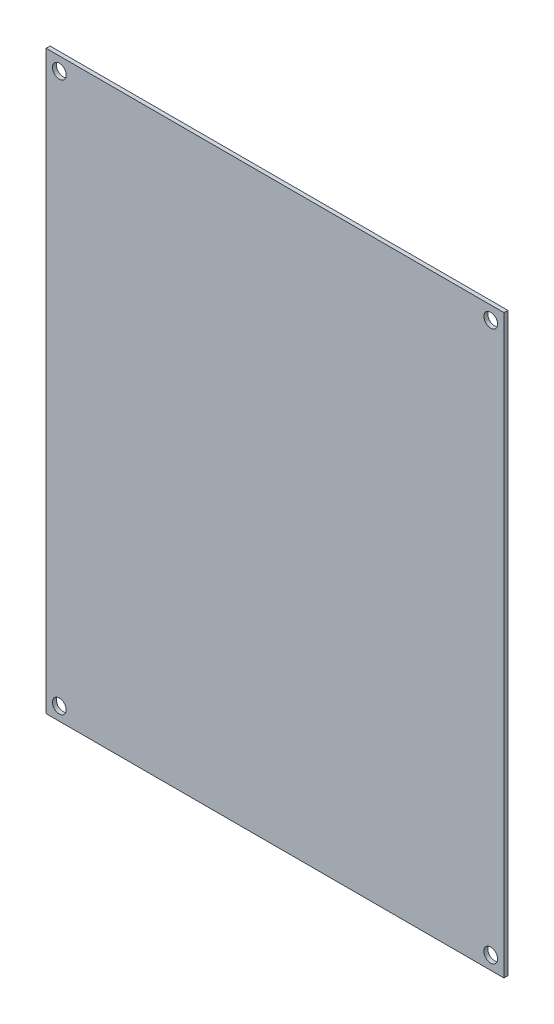
ISO-10303-21;
HEADER;
FILE_DESCRIPTION(('STEP AP214'),'2;1');
FILE_NAME('part.step','',(''),(''),'','','');
FILE_SCHEMA(('AUTOMOTIVE_DESIGN { 1 0 10303 214 1 1 1 1 }'));
ENDSEC;
DATA;
#1=APPLICATION_CONTEXT('core data for automotive mechanical design processes');
#2=APPLICATION_PROTOCOL_DEFINITION('international standard','automotive_design',2000,#1);
#3=PRODUCT_CONTEXT('',#1,'mechanical');
#4=PRODUCT('Part','Part','',(#3));
#5=PRODUCT_RELATED_PRODUCT_CATEGORY('part','',(#4));
#6=PRODUCT_DEFINITION_FORMATION('','',#4);
#7=PRODUCT_DEFINITION_CONTEXT('part definition',#1,'design');
#8=PRODUCT_DEFINITION('design','',#6,#7);
#9=PRODUCT_DEFINITION_SHAPE('','',#8);
#10=(LENGTH_UNIT() NAMED_UNIT(*) SI_UNIT(.MILLI.,.METRE.));
#11=(NAMED_UNIT(*) PLANE_ANGLE_UNIT() SI_UNIT($,.RADIAN.));
#12=(NAMED_UNIT(*) SI_UNIT($,.STERADIAN.) SOLID_ANGLE_UNIT());
#13=UNCERTAINTY_MEASURE_WITH_UNIT(LENGTH_MEASURE(1.E-05),#10,'distance_accuracy_value','');
#14=(GEOMETRIC_REPRESENTATION_CONTEXT(3) GLOBAL_UNCERTAINTY_ASSIGNED_CONTEXT((#13)) GLOBAL_UNIT_ASSIGNED_CONTEXT((#10,
#11,#12)) REPRESENTATION_CONTEXT('',''));
#15=CARTESIAN_POINT('',(0.,0.,0.));
#16=DIRECTION('',(0.,0.,1.));
#17=DIRECTION('',(1.,0.,0.));
#18=AXIS2_PLACEMENT_3D('',#15,#16,#17);
#19=CARTESIAN_POINT('',(0.,0.,1.));
#20=DIRECTION('',(0.,0.,1.));
#21=DIRECTION('',(1.,0.,0.));
#22=AXIS2_PLACEMENT_3D('',#19,#20,#21);
#23=PLANE('',#22);
#24=CARTESIAN_POINT('',(54.6500000000001,-69.65,1.));
#25=DIRECTION('',(0.,0.,1.));
#26=DIRECTION('',(1.,0.,0.));
#27=AXIS2_PLACEMENT_3D('',#24,#25,#26);
#28=CIRCLE('',#27,1.75);
#29=CARTESIAN_POINT('',(56.4000000000001,-69.65,1.));
#30=VERTEX_POINT('',#29);
#31=EDGE_CURVE('E123',#30,#30,#28,.T.);
#32=ORIENTED_EDGE('',*,*,#31,.F.);
#33=EDGE_LOOP('',(#32));
#34=FACE_BOUND('',#33,.T.);
#35=CARTESIAN_POINT('',(-54.65,69.65,1.));
#36=DIRECTION('',(0.,0.,1.));
#37=DIRECTION('',(1.,0.,0.));
#38=AXIS2_PLACEMENT_3D('',#35,#36,#37);
#39=CIRCLE('',#38,1.75);
#40=CARTESIAN_POINT('',(-52.9,69.65,1.));
#41=VERTEX_POINT('',#40);
#42=EDGE_CURVE('E102',#41,#41,#39,.T.);
#43=ORIENTED_EDGE('',*,*,#42,.F.);
#44=EDGE_LOOP('',(#43));
#45=FACE_BOUND('',#44,.T.);
#46=DIRECTION('',(0.,1.,0.));
#47=VECTOR('',#46,1.);
#48=CARTESIAN_POINT('',(58.,73.,1.));
#49=LINE('',#48,#47);
#50=CARTESIAN_POINT('',(58.,-73.,1.));
#51=VERTEX_POINT('',#50);
#52=CARTESIAN_POINT('',(58.,73.,1.));
#53=VERTEX_POINT('',#52);
#54=EDGE_CURVE('E87',#51,#53,#49,.T.);
#55=ORIENTED_EDGE('',*,*,#54,.T.);
#56=DIRECTION('',(-1.,0.,0.));
#57=VECTOR('',#56,1.);
#58=CARTESIAN_POINT('',(-58.,73.,1.));
#59=LINE('',#58,#57);
#60=CARTESIAN_POINT('',(-58.,73.,1.));
#61=VERTEX_POINT('',#60);
#62=EDGE_CURVE('E82',#53,#61,#59,.T.);
#63=ORIENTED_EDGE('',*,*,#62,.T.);
#64=DIRECTION('',(0.,-1.,0.));
#65=VECTOR('',#64,1.);
#66=CARTESIAN_POINT('',(-58.,73.,1.));
#67=LINE('',#66,#65);
#68=CARTESIAN_POINT('',(-58.,-73.,1.));
#69=VERTEX_POINT('',#68);
#70=EDGE_CURVE('E85',#61,#69,#67,.T.);
#71=ORIENTED_EDGE('',*,*,#70,.T.);
#72=DIRECTION('',(1.,0.,0.));
#73=VECTOR('',#72,1.);
#74=CARTESIAN_POINT('',(-58.,-73.,1.));
#75=LINE('',#74,#73);
#76=EDGE_CURVE('E52',#69,#51,#75,.T.);
#77=ORIENTED_EDGE('',*,*,#76,.T.);
#78=EDGE_LOOP('',(#55,#63,#71,#77));
#79=FACE_BOUND('',#78,.T.);
#80=CARTESIAN_POINT('',(54.65,69.65,1.));
#81=DIRECTION('',(0.,0.,1.));
#82=DIRECTION('',(1.,0.,0.));
#83=AXIS2_PLACEMENT_3D('',#80,#81,#82);
#84=CIRCLE('',#83,1.75);
#85=CARTESIAN_POINT('',(56.4,69.65,1.));
#86=VERTEX_POINT('',#85);
#87=EDGE_CURVE('E117',#86,#86,#84,.T.);
#88=ORIENTED_EDGE('',*,*,#87,.F.);
#89=EDGE_LOOP('',(#88));
#90=FACE_BOUND('',#89,.T.);
#91=CARTESIAN_POINT('',(-54.65,-69.65,1.));
#92=DIRECTION('',(0.,0.,1.));
#93=DIRECTION('',(1.,0.,0.));
#94=AXIS2_PLACEMENT_3D('',#91,#92,#93);
#95=CIRCLE('',#94,1.75);
#96=CARTESIAN_POINT('',(-52.9,-69.65,1.));
#97=VERTEX_POINT('',#96);
#98=EDGE_CURVE('E129',#97,#97,#95,.T.);
#99=ORIENTED_EDGE('',*,*,#98,.F.);
#100=EDGE_LOOP('',(#99));
#101=FACE_BOUND('',#100,.T.);
#102=ADVANCED_FACE('F35',(#34,#45,#79,#90,#101),#23,.T.);
#103=CARTESIAN_POINT('',(0.,0.,0.));
#104=DIRECTION('',(0.,0.,1.));
#105=DIRECTION('',(1.,0.,0.));
#106=AXIS2_PLACEMENT_3D('',#103,#104,#105);
#107=PLANE('',#106);
#108=DIRECTION('',(0.,1.,0.));
#109=VECTOR('',#108,1.);
#110=CARTESIAN_POINT('',(58.,73.,0.));
#111=LINE('',#110,#109);
#112=CARTESIAN_POINT('',(58.,-73.,0.));
#113=VERTEX_POINT('',#112);
#114=CARTESIAN_POINT('',(58.,73.,0.));
#115=VERTEX_POINT('',#114);
#116=EDGE_CURVE('E99',#113,#115,#111,.T.);
#117=ORIENTED_EDGE('',*,*,#116,.F.);
#118=DIRECTION('',(1.,0.,0.));
#119=VECTOR('',#118,1.);
#120=CARTESIAN_POINT('',(-58.,-73.,0.));
#121=LINE('',#120,#119);
#122=CARTESIAN_POINT('',(-58.,-73.,0.));
#123=VERTEX_POINT('',#122);
#124=EDGE_CURVE('E75',#123,#113,#121,.T.);
#125=ORIENTED_EDGE('',*,*,#124,.F.);
#126=DIRECTION('',(0.,-1.,0.));
#127=VECTOR('',#126,1.);
#128=CARTESIAN_POINT('',(-58.,73.,0.));
#129=LINE('',#128,#127);
#130=CARTESIAN_POINT('',(-58.,73.,0.));
#131=VERTEX_POINT('',#130);
#132=EDGE_CURVE('E69',#131,#123,#129,.T.);
#133=ORIENTED_EDGE('',*,*,#132,.F.);
#134=DIRECTION('',(-1.,0.,0.));
#135=VECTOR('',#134,1.);
#136=CARTESIAN_POINT('',(-58.,73.,0.));
#137=LINE('',#136,#135);
#138=EDGE_CURVE('E91',#115,#131,#137,.T.);
#139=ORIENTED_EDGE('',*,*,#138,.F.);
#140=EDGE_LOOP('',(#117,#125,#133,#139));
#141=FACE_BOUND('',#140,.T.);
#142=CARTESIAN_POINT('',(-54.65,69.65,0.));
#143=DIRECTION('',(0.,0.,1.));
#144=DIRECTION('',(1.,0.,0.));
#145=AXIS2_PLACEMENT_3D('',#142,#143,#144);
#146=CIRCLE('',#145,1.75);
#147=CARTESIAN_POINT('',(-52.9,69.65,0.));
#148=VERTEX_POINT('',#147);
#149=EDGE_CURVE('E114',#148,#148,#146,.T.);
#150=ORIENTED_EDGE('',*,*,#149,.T.);
#151=EDGE_LOOP('',(#150));
#152=FACE_BOUND('',#151,.T.);
#153=CARTESIAN_POINT('',(54.65,69.65,0.));
#154=DIRECTION('',(0.,0.,1.));
#155=DIRECTION('',(1.,0.,0.));
#156=AXIS2_PLACEMENT_3D('',#153,#154,#155);
#157=CIRCLE('',#156,1.75);
#158=CARTESIAN_POINT('',(56.4,69.65,0.));
#159=VERTEX_POINT('',#158);
#160=EDGE_CURVE('E120',#159,#159,#157,.T.);
#161=ORIENTED_EDGE('',*,*,#160,.T.);
#162=EDGE_LOOP('',(#161));
#163=FACE_BOUND('',#162,.T.);
#164=CARTESIAN_POINT('',(54.6500000000001,-69.65,0.));
#165=DIRECTION('',(0.,0.,1.));
#166=DIRECTION('',(1.,0.,0.));
#167=AXIS2_PLACEMENT_3D('',#164,#165,#166);
#168=CIRCLE('',#167,1.75);
#169=CARTESIAN_POINT('',(56.4000000000001,-69.65,0.));
#170=VERTEX_POINT('',#169);
#171=EDGE_CURVE('E126',#170,#170,#168,.T.);
#172=ORIENTED_EDGE('',*,*,#171,.T.);
#173=EDGE_LOOP('',(#172));
#174=FACE_BOUND('',#173,.T.);
#175=CARTESIAN_POINT('',(-54.65,-69.65,0.));
#176=DIRECTION('',(0.,0.,1.));
#177=DIRECTION('',(1.,0.,0.));
#178=AXIS2_PLACEMENT_3D('',#175,#176,#177);
#179=CIRCLE('',#178,1.75);
#180=CARTESIAN_POINT('',(-52.9,-69.65,0.));
#181=VERTEX_POINT('',#180);
#182=EDGE_CURVE('E132',#181,#181,#179,.T.);
#183=ORIENTED_EDGE('',*,*,#182,.T.);
#184=EDGE_LOOP('',(#183));
#185=FACE_BOUND('',#184,.T.);
#186=ADVANCED_FACE('F110',(#141,#152,#163,#174,#185),#107,.F.);
#187=CARTESIAN_POINT('',(58.,73.,1.));
#188=DIRECTION('',(-1.,0.,0.));
#189=DIRECTION('',(0.,0.,1.));
#190=AXIS2_PLACEMENT_3D('',#187,#188,#189);
#191=PLANE('',#190);
#192=ORIENTED_EDGE('',*,*,#116,.T.);
#193=DIRECTION('',(0.,0.,-1.));
#194=VECTOR('',#193,1.);
#195=CARTESIAN_POINT('',(58.,73.,1.));
#196=LINE('',#195,#194);
#197=EDGE_CURVE('E11',#53,#115,#196,.T.);
#198=ORIENTED_EDGE('',*,*,#197,.F.);
#199=ORIENTED_EDGE('',*,*,#54,.F.);
#200=DIRECTION('',(0.,0.,-1.));
#201=VECTOR('',#200,1.);
#202=CARTESIAN_POINT('',(58.,-73.,1.));
#203=LINE('',#202,#201);
#204=EDGE_CURVE('E95',#51,#113,#203,.T.);
#205=ORIENTED_EDGE('',*,*,#204,.T.);
#206=EDGE_LOOP('',(#192,#198,#199,#205));
#207=FACE_BOUND('',#206,.T.);
#208=ADVANCED_FACE('F37',(#207),#191,.F.);
#209=CARTESIAN_POINT('',(-58.,73.,1.));
#210=DIRECTION('',(0.,-1.,0.));
#211=DIRECTION('',(0.,0.,-1.));
#212=AXIS2_PLACEMENT_3D('',#209,#210,#211);
#213=PLANE('',#212);
#214=ORIENTED_EDGE('',*,*,#138,.T.);
#215=DIRECTION('',(0.,0.,-1.));
#216=VECTOR('',#215,1.);
#217=CARTESIAN_POINT('',(-58.,73.,1.));
#218=LINE('',#217,#216);
#219=EDGE_CURVE('E44',#61,#131,#218,.T.);
#220=ORIENTED_EDGE('',*,*,#219,.F.);
#221=ORIENTED_EDGE('',*,*,#62,.F.);
#222=ORIENTED_EDGE('',*,*,#197,.T.);
#223=EDGE_LOOP('',(#214,#220,#221,#222));
#224=FACE_BOUND('',#223,.T.);
#225=ADVANCED_FACE('F90',(#224),#213,.F.);
#226=CARTESIAN_POINT('',(-58.,73.,1.));
#227=DIRECTION('',(1.,0.,0.));
#228=DIRECTION('',(0.,1.,0.));
#229=AXIS2_PLACEMENT_3D('',#226,#227,#228);
#230=PLANE('',#229);
#231=ORIENTED_EDGE('',*,*,#132,.T.);
#232=DIRECTION('',(0.,0.,-1.));
#233=VECTOR('',#232,1.);
#234=CARTESIAN_POINT('',(-58.,-73.,1.));
#235=LINE('',#234,#233);
#236=EDGE_CURVE('E92',#69,#123,#235,.T.);
#237=ORIENTED_EDGE('',*,*,#236,.F.);
#238=ORIENTED_EDGE('',*,*,#70,.F.);
#239=ORIENTED_EDGE('',*,*,#219,.T.);
#240=EDGE_LOOP('',(#231,#237,#238,#239));
#241=FACE_BOUND('',#240,.T.);
#242=ADVANCED_FACE('F93',(#241),#230,.F.);
#243=CARTESIAN_POINT('',(-58.,-73.,1.));
#244=DIRECTION('',(0.,1.,0.));
#245=DIRECTION('',(0.,0.,1.));
#246=AXIS2_PLACEMENT_3D('',#243,#244,#245);
#247=PLANE('',#246);
#248=ORIENTED_EDGE('',*,*,#124,.T.);
#249=ORIENTED_EDGE('',*,*,#204,.F.);
#250=ORIENTED_EDGE('',*,*,#76,.F.);
#251=ORIENTED_EDGE('',*,*,#236,.T.);
#252=EDGE_LOOP('',(#248,#249,#250,#251));
#253=FACE_BOUND('',#252,.T.);
#254=ADVANCED_FACE('F107',(#253),#247,.F.);
#255=CARTESIAN_POINT('',(-54.65,69.65,1.));
#256=DIRECTION('',(0.,0.,-1.));
#257=DIRECTION('',(-1.,0.,0.));
#258=AXIS2_PLACEMENT_3D('',#255,#256,#257);
#259=CYLINDRICAL_SURFACE('',#258,1.75);
#260=ORIENTED_EDGE('',*,*,#42,.T.);
#261=EDGE_LOOP('',(#260));
#262=FACE_BOUND('',#261,.T.);
#263=ORIENTED_EDGE('',*,*,#149,.F.);
#264=EDGE_LOOP('',(#263));
#265=FACE_BOUND('',#264,.T.);
#266=ADVANCED_FACE('F151',(#262,#265),#259,.F.);
#267=CARTESIAN_POINT('',(54.65,69.65,1.));
#268=DIRECTION('',(0.,0.,-1.));
#269=DIRECTION('',(-1.,0.,0.));
#270=AXIS2_PLACEMENT_3D('',#267,#268,#269);
#271=CYLINDRICAL_SURFACE('',#270,1.75);
#272=ORIENTED_EDGE('',*,*,#87,.T.);
#273=EDGE_LOOP('',(#272));
#274=FACE_BOUND('',#273,.T.);
#275=ORIENTED_EDGE('',*,*,#160,.F.);
#276=EDGE_LOOP('',(#275));
#277=FACE_BOUND('',#276,.T.);
#278=ADVANCED_FACE('F197',(#274,#277),#271,.F.);
#279=CARTESIAN_POINT('',(54.6500000000001,-69.65,1.));
#280=DIRECTION('',(0.,0.,-1.));
#281=DIRECTION('',(-1.,0.,0.));
#282=AXIS2_PLACEMENT_3D('',#279,#280,#281);
#283=CYLINDRICAL_SURFACE('',#282,1.75);
#284=ORIENTED_EDGE('',*,*,#31,.T.);
#285=EDGE_LOOP('',(#284));
#286=FACE_BOUND('',#285,.T.);
#287=ORIENTED_EDGE('',*,*,#171,.F.);
#288=EDGE_LOOP('',(#287));
#289=FACE_BOUND('',#288,.T.);
#290=ADVANCED_FACE('F205',(#286,#289),#283,.F.);
#291=CARTESIAN_POINT('',(-54.65,-69.65,1.));
#292=DIRECTION('',(0.,0.,-1.));
#293=DIRECTION('',(-1.,0.,0.));
#294=AXIS2_PLACEMENT_3D('',#291,#292,#293);
#295=CYLINDRICAL_SURFACE('',#294,1.75);
#296=ORIENTED_EDGE('',*,*,#98,.T.);
#297=EDGE_LOOP('',(#296));
#298=FACE_BOUND('',#297,.T.);
#299=ORIENTED_EDGE('',*,*,#182,.F.);
#300=EDGE_LOOP('',(#299));
#301=FACE_BOUND('',#300,.T.);
#302=ADVANCED_FACE('F138',(#298,#301),#295,.F.);
#303=CLOSED_SHELL('',(#102,#186,#208,#225,#242,#254,#266,#278,#290,#302));
#304=MANIFOLD_SOLID_BREP('B2',#303);
#305=ADVANCED_BREP_SHAPE_REPRESENTATION('',(#18,#304),#14);
#306=SHAPE_DEFINITION_REPRESENTATION(#9,#305);
ENDSEC;
END-ISO-10303-21;
